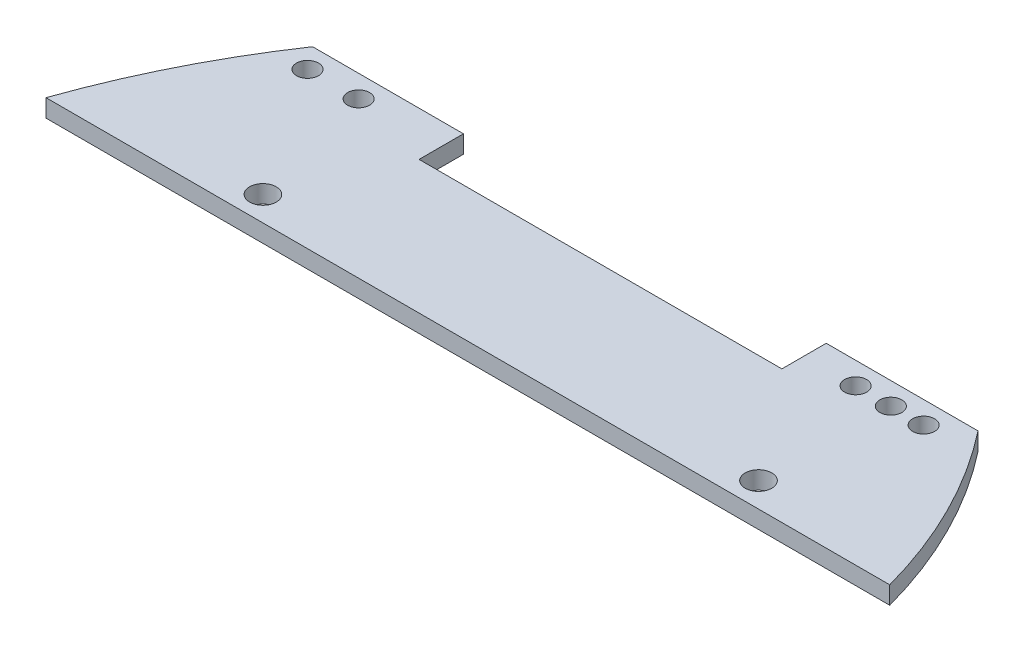
ISO-10303-21;
HEADER;
FILE_DESCRIPTION(('STEP AP214'),'2;1');
FILE_NAME('part.step','',(''),(''),'','','');
FILE_SCHEMA(('AUTOMOTIVE_DESIGN { 1 0 10303 214 1 1 1 1 }'));
ENDSEC;
DATA;
#1=APPLICATION_CONTEXT('core data for automotive mechanical design processes');
#2=APPLICATION_PROTOCOL_DEFINITION('international standard','automotive_design',2000,#1);
#3=PRODUCT_CONTEXT('',#1,'mechanical');
#4=PRODUCT('Part','Part','',(#3));
#5=PRODUCT_RELATED_PRODUCT_CATEGORY('part','',(#4));
#6=PRODUCT_DEFINITION_FORMATION('','',#4);
#7=PRODUCT_DEFINITION_CONTEXT('part definition',#1,'design');
#8=PRODUCT_DEFINITION('design','',#6,#7);
#9=PRODUCT_DEFINITION_SHAPE('','',#8);
#10=(LENGTH_UNIT() NAMED_UNIT(*) SI_UNIT(.MILLI.,.METRE.));
#11=(NAMED_UNIT(*) PLANE_ANGLE_UNIT() SI_UNIT($,.RADIAN.));
#12=(NAMED_UNIT(*) SI_UNIT($,.STERADIAN.) SOLID_ANGLE_UNIT());
#13=UNCERTAINTY_MEASURE_WITH_UNIT(LENGTH_MEASURE(1.E-05),#10,'distance_accuracy_value','');
#14=(GEOMETRIC_REPRESENTATION_CONTEXT(3) GLOBAL_UNCERTAINTY_ASSIGNED_CONTEXT((#13)) GLOBAL_UNIT_ASSIGNED_CONTEXT((#10,
#11,#12)) REPRESENTATION_CONTEXT('',''));
#15=CARTESIAN_POINT('',(0.,0.,0.));
#16=DIRECTION('',(0.,0.,1.));
#17=DIRECTION('',(1.,0.,0.));
#18=AXIS2_PLACEMENT_3D('',#15,#16,#17);
#19=CARTESIAN_POINT('',(-37.5,2.,0.));
#20=DIRECTION('',(0.,0.,1.));
#21=DIRECTION('',(1.,0.,0.));
#22=AXIS2_PLACEMENT_3D('',#19,#20,#21);
#23=PLANE('',#22);
#24=DIRECTION('',(-1.,0.,0.));
#25=VECTOR('',#24,1.);
#26=CARTESIAN_POINT('',(-37.5,2.,0.));
#27=LINE('',#26,#25);
#28=CARTESIAN_POINT('',(-20.5,2.,0.));
#29=VERTEX_POINT('',#28);
#30=CARTESIAN_POINT('',(-37.5,2.,0.));
#31=VERTEX_POINT('',#30);
#32=EDGE_CURVE('E173',#29,#31,#27,.T.);
#33=ORIENTED_EDGE('',*,*,#32,.F.);
#34=DIRECTION('',(0.,1.,0.));
#35=VECTOR('',#34,1.);
#36=CARTESIAN_POINT('',(-20.5,0.,0.));
#37=LINE('',#36,#35);
#38=CARTESIAN_POINT('',(-20.5,0.,0.));
#39=VERTEX_POINT('',#38);
#40=EDGE_CURVE('E161',#39,#29,#37,.T.);
#41=ORIENTED_EDGE('',*,*,#40,.F.);
#42=DIRECTION('',(-1.,0.,0.));
#43=VECTOR('',#42,1.);
#44=CARTESIAN_POINT('',(-37.5,0.,0.));
#45=LINE('',#44,#43);
#46=CARTESIAN_POINT('',(-37.5,0.,0.));
#47=VERTEX_POINT('',#46);
#48=EDGE_CURVE('E143',#39,#47,#45,.T.);
#49=ORIENTED_EDGE('',*,*,#48,.T.);
#50=DIRECTION('',(0.,-1.,0.));
#51=VECTOR('',#50,1.);
#52=CARTESIAN_POINT('',(-37.5,2.,0.));
#53=LINE('',#52,#51);
#54=EDGE_CURVE('E54',#31,#47,#53,.T.);
#55=ORIENTED_EDGE('',*,*,#54,.F.);
#56=EDGE_LOOP('',(#33,#41,#49,#55));
#57=FACE_BOUND('',#56,.T.);
#58=ADVANCED_FACE('F45',(#57),#23,.F.);
#59=CARTESIAN_POINT('',(-6.52717629431904,2.,34.6522980439395));
#60=DIRECTION('',(0.,-1.,0.));
#61=DIRECTION('',(0.,0.,-1.));
#62=AXIS2_PLACEMENT_3D('',#59,#60,#61);
#63=CYLINDRICAL_SURFACE('',#62,56.0283322273389);
#64=CARTESIAN_POINT('',(-6.52717629431904,0.,34.6522980439395));
#65=DIRECTION('',(0.,1.,0.));
#66=DIRECTION('',(0.,0.,-1.));
#67=AXIS2_PLACEMENT_3D('',#64,#65,#66);
#68=CIRCLE('',#67,56.0283322273389);
#69=CARTESIAN_POINT('',(47.5513238162483,0.,20.));
#70=VERTEX_POINT('',#69);
#71=CARTESIAN_POINT('',(37.5,0.,0.));
#72=VERTEX_POINT('',#71);
#73=EDGE_CURVE('E164',#70,#72,#68,.T.);
#74=ORIENTED_EDGE('',*,*,#73,.T.);
#75=DIRECTION('',(0.,-1.,0.));
#76=VECTOR('',#75,1.);
#77=CARTESIAN_POINT('',(37.5,2.,0.));
#78=LINE('',#77,#76);
#79=CARTESIAN_POINT('',(37.5,2.,0.));
#80=VERTEX_POINT('',#79);
#81=EDGE_CURVE('E11',#80,#72,#78,.T.);
#82=ORIENTED_EDGE('',*,*,#81,.F.);
#83=CARTESIAN_POINT('',(-6.52717629431904,2.,34.6522980439395));
#84=DIRECTION('',(0.,1.,0.));
#85=DIRECTION('',(0.,0.,-1.));
#86=AXIS2_PLACEMENT_3D('',#83,#84,#85);
#87=CIRCLE('',#86,56.0283322273389);
#88=CARTESIAN_POINT('',(47.5513238162483,2.,20.));
#89=VERTEX_POINT('',#88);
#90=EDGE_CURVE('E170',#89,#80,#87,.T.);
#91=ORIENTED_EDGE('',*,*,#90,.F.);
#92=DIRECTION('',(0.,-1.,0.));
#93=VECTOR('',#92,1.);
#94=CARTESIAN_POINT('',(47.5513238162483,2.,20.));
#95=LINE('',#94,#93);
#96=EDGE_CURVE('E181',#89,#70,#95,.T.);
#97=ORIENTED_EDGE('',*,*,#96,.T.);
#98=EDGE_LOOP('',(#74,#82,#91,#97));
#99=FACE_BOUND('',#98,.T.);
#100=ADVANCED_FACE('F47',(#99),#63,.T.);
#101=CARTESIAN_POINT('',(20.3949385789422,0.,0.));
#102=VERTEX_POINT('',#101);
#103=EDGE_CURVE('E185',#72,#102,#45,.T.);
#104=ORIENTED_EDGE('',*,*,#103,.T.);
#105=DIRECTION('',(0.,1.,0.));
#106=VECTOR('',#105,1.);
#107=CARTESIAN_POINT('',(20.3949385789422,0.,0.));
#108=LINE('',#107,#106);
#109=CARTESIAN_POINT('',(20.3949385789422,2.,0.));
#110=VERTEX_POINT('',#109);
#111=EDGE_CURVE('E165',#102,#110,#108,.T.);
#112=ORIENTED_EDGE('',*,*,#111,.T.);
#113=EDGE_CURVE('E98',#80,#110,#27,.T.);
#114=ORIENTED_EDGE('',*,*,#113,.F.);
#115=ORIENTED_EDGE('',*,*,#81,.T.);
#116=EDGE_LOOP('',(#104,#112,#114,#115));
#117=FACE_BOUND('',#116,.T.);
#118=ADVANCED_FACE('F222',(#117),#23,.F.);
#119=CARTESIAN_POINT('',(34.4689479159723,2.,48.6948877723841));
#120=DIRECTION('',(0.,-1.,0.));
#121=DIRECTION('',(0.,0.,-1.));
#122=AXIS2_PLACEMENT_3D('',#119,#120,#121);
#123=CYLINDRICAL_SURFACE('',#122,86.8948879928906);
#124=CARTESIAN_POINT('',(34.4689479159723,0.,48.6948877723841));
#125=DIRECTION('',(0.,1.,0.));
#126=DIRECTION('',(0.,0.,1.));
#127=AXIS2_PLACEMENT_3D('',#124,#125,#126);
#128=CIRCLE('',#127,86.8948879928906);
#129=CARTESIAN_POINT('',(-47.5513238162483,0.,20.));
#130=VERTEX_POINT('',#129);
#131=EDGE_CURVE('E189',#47,#130,#128,.T.);
#132=ORIENTED_EDGE('',*,*,#131,.T.);
#133=DIRECTION('',(0.,-1.,0.));
#134=VECTOR('',#133,1.);
#135=CARTESIAN_POINT('',(-47.5513238162483,2.,20.));
#136=LINE('',#135,#134);
#137=CARTESIAN_POINT('',(-47.5513238162483,2.,20.));
#138=VERTEX_POINT('',#137);
#139=EDGE_CURVE('E196',#138,#130,#136,.T.);
#140=ORIENTED_EDGE('',*,*,#139,.F.);
#141=CARTESIAN_POINT('',(34.4689479159723,2.,48.6948877723841));
#142=DIRECTION('',(0.,1.,0.));
#143=DIRECTION('',(0.,0.,1.));
#144=AXIS2_PLACEMENT_3D('',#141,#142,#143);
#145=CIRCLE('',#144,86.8948879928906);
#146=EDGE_CURVE('E176',#31,#138,#145,.T.);
#147=ORIENTED_EDGE('',*,*,#146,.F.);
#148=ORIENTED_EDGE('',*,*,#54,.T.);
#149=EDGE_LOOP('',(#132,#140,#147,#148));
#150=FACE_BOUND('',#149,.T.);
#151=ADVANCED_FACE('F203',(#150),#123,.T.);
#152=CARTESIAN_POINT('',(-47.5513238162483,2.,20.));
#153=DIRECTION('',(0.,0.,-1.));
#154=DIRECTION('',(-1.,0.,0.));
#155=AXIS2_PLACEMENT_3D('',#152,#153,#154);
#156=PLANE('',#155);
#157=DIRECTION('',(1.,0.,0.));
#158=VECTOR('',#157,1.);
#159=CARTESIAN_POINT('',(-47.5513238162483,0.,20.));
#160=LINE('',#159,#158);
#161=EDGE_CURVE('E91',#130,#70,#160,.T.);
#162=ORIENTED_EDGE('',*,*,#161,.T.);
#163=ORIENTED_EDGE('',*,*,#96,.F.);
#164=DIRECTION('',(1.,0.,0.));
#165=VECTOR('',#164,1.);
#166=CARTESIAN_POINT('',(-47.5513238162483,2.,20.));
#167=LINE('',#166,#165);
#168=EDGE_CURVE('E70',#138,#89,#167,.T.);
#169=ORIENTED_EDGE('',*,*,#168,.F.);
#170=ORIENTED_EDGE('',*,*,#139,.T.);
#171=EDGE_LOOP('',(#162,#163,#169,#170));
#172=FACE_BOUND('',#171,.T.);
#173=ADVANCED_FACE('F211',(#172),#156,.F.);
#174=CARTESIAN_POINT('',(-6.52717629431904,2.,34.6522980439395));
#175=DIRECTION('',(0.,-1.,0.));
#176=DIRECTION('',(0.,0.,-1.));
#177=AXIS2_PLACEMENT_3D('',#174,#175,#176);
#178=PLANE('',#177);
#179=CARTESIAN_POINT('',(-25.8803145300549,2.,17.2197010936735));
#180=DIRECTION('',(0.,1.,0.));
#181=DIRECTION('',(0.,0.,1.));
#182=AXIS2_PLACEMENT_3D('',#179,#180,#181);
#183=CIRCLE('',#182,1.5);
#184=CARTESIAN_POINT('',(-25.8803145300549,2.,18.7197010936735));
#185=VERTEX_POINT('',#184);
#186=EDGE_CURVE('E310',#185,#185,#183,.T.);
#187=ORIENTED_EDGE('',*,*,#186,.F.);
#188=EDGE_LOOP('',(#187));
#189=FACE_BOUND('',#188,.T.);
#190=CARTESIAN_POINT('',(29.9799259658057,2.,17.2197010936735));
#191=DIRECTION('',(0.,1.,0.));
#192=DIRECTION('',(0.,0.,1.));
#193=AXIS2_PLACEMENT_3D('',#190,#191,#192);
#194=CIRCLE('',#193,1.5);
#195=CARTESIAN_POINT('',(29.9799259658057,2.,18.7197010936735));
#196=VERTEX_POINT('',#195);
#197=EDGE_CURVE('E306',#196,#196,#194,.T.);
#198=ORIENTED_EDGE('',*,*,#197,.F.);
#199=EDGE_LOOP('',(#198));
#200=FACE_BOUND('',#199,.T.);
#201=CARTESIAN_POINT('',(33.8698431599721,2.,2.5));
#202=DIRECTION('',(0.,1.,0.));
#203=DIRECTION('',(0.,0.,1.));
#204=AXIS2_PLACEMENT_3D('',#201,#202,#203);
#205=CIRCLE('',#204,1.24);
#206=CARTESIAN_POINT('',(33.8698431599721,2.,3.74));
#207=VERTEX_POINT('',#206);
#208=EDGE_CURVE('E283',#207,#207,#205,.T.);
#209=ORIENTED_EDGE('',*,*,#208,.F.);
#210=EDGE_LOOP('',(#209));
#211=FACE_BOUND('',#210,.T.);
#212=CARTESIAN_POINT('',(30.1746052653553,2.,2.5));
#213=DIRECTION('',(0.,1.,0.));
#214=DIRECTION('',(0.,0.,1.));
#215=AXIS2_PLACEMENT_3D('',#212,#213,#214);
#216=CIRCLE('',#215,1.24);
#217=CARTESIAN_POINT('',(30.1746052653553,2.,3.74));
#218=VERTEX_POINT('',#217);
#219=EDGE_CURVE('E289',#218,#218,#216,.T.);
#220=ORIENTED_EDGE('',*,*,#219,.F.);
#221=EDGE_LOOP('',(#220));
#222=FACE_BOUND('',#221,.T.);
#223=CARTESIAN_POINT('',(-35.5742504810952,2.,2.5));
#224=DIRECTION('',(0.,1.,0.));
#225=DIRECTION('',(0.,0.,1.));
#226=AXIS2_PLACEMENT_3D('',#223,#224,#225);
#227=CIRCLE('',#226,1.24);
#228=CARTESIAN_POINT('',(-35.5742504810952,2.,3.74));
#229=VERTEX_POINT('',#228);
#230=EDGE_CURVE('E295',#229,#229,#227,.T.);
#231=ORIENTED_EDGE('',*,*,#230,.F.);
#232=EDGE_LOOP('',(#231));
#233=FACE_BOUND('',#232,.T.);
#234=CARTESIAN_POINT('',(26.2041900807139,2.,2.5));
#235=DIRECTION('',(0.,1.,0.));
#236=DIRECTION('',(0.,0.,1.));
#237=AXIS2_PLACEMENT_3D('',#234,#235,#236);
#238=CIRCLE('',#237,1.24);
#239=CARTESIAN_POINT('',(26.2041900807139,2.,3.74));
#240=VERTEX_POINT('',#239);
#241=EDGE_CURVE('E279',#240,#240,#238,.T.);
#242=ORIENTED_EDGE('',*,*,#241,.F.);
#243=EDGE_LOOP('',(#242));
#244=FACE_BOUND('',#243,.T.);
#245=CARTESIAN_POINT('',(-29.8148259775896,2.,2.5));
#246=DIRECTION('',(0.,1.,0.));
#247=DIRECTION('',(0.,0.,1.));
#248=AXIS2_PLACEMENT_3D('',#245,#246,#247);
#249=CIRCLE('',#248,1.24);
#250=CARTESIAN_POINT('',(-29.8148259775896,2.,3.74));
#251=VERTEX_POINT('',#250);
#252=EDGE_CURVE('E151',#251,#251,#249,.T.);
#253=ORIENTED_EDGE('',*,*,#252,.F.);
#254=EDGE_LOOP('',(#253));
#255=FACE_BOUND('',#254,.T.);
#256=DIRECTION('',(1.,0.,0.));
#257=VECTOR('',#256,1.);
#258=CARTESIAN_POINT('',(20.3949385789422,2.,5.));
#259=LINE('',#258,#257);
#260=CARTESIAN_POINT('',(-20.5,2.,5.));
#261=VERTEX_POINT('',#260);
#262=CARTESIAN_POINT('',(20.3949385789422,2.,5.));
#263=VERTEX_POINT('',#262);
#264=EDGE_CURVE('E148',#261,#263,#259,.T.);
#265=ORIENTED_EDGE('',*,*,#264,.F.);
#266=DIRECTION('',(0.,0.,1.));
#267=VECTOR('',#266,1.);
#268=CARTESIAN_POINT('',(-20.5,2.,5.));
#269=LINE('',#268,#267);
#270=EDGE_CURVE('E127',#29,#261,#269,.T.);
#271=ORIENTED_EDGE('',*,*,#270,.F.);
#272=ORIENTED_EDGE('',*,*,#32,.T.);
#273=ORIENTED_EDGE('',*,*,#146,.T.);
#274=ORIENTED_EDGE('',*,*,#168,.T.);
#275=ORIENTED_EDGE('',*,*,#90,.T.);
#276=ORIENTED_EDGE('',*,*,#113,.T.);
#277=DIRECTION('',(0.,0.,-1.));
#278=VECTOR('',#277,1.);
#279=CARTESIAN_POINT('',(20.3949385789422,2.,0.));
#280=LINE('',#279,#278);
#281=EDGE_CURVE('E145',#263,#110,#280,.T.);
#282=ORIENTED_EDGE('',*,*,#281,.F.);
#283=EDGE_LOOP('',(#265,#271,#272,#273,#274,#275,#276,#282));
#284=FACE_BOUND('',#283,.T.);
#285=ADVANCED_FACE('F213',(#189,#200,#211,#222,#233,#244,#255,#284),#178,.F.);
#286=CARTESIAN_POINT('',(-6.52717629431904,0.,34.6522980439395));
#287=DIRECTION('',(0.,-1.,0.));
#288=DIRECTION('',(0.,0.,-1.));
#289=AXIS2_PLACEMENT_3D('',#286,#287,#288);
#290=PLANE('',#289);
#291=CARTESIAN_POINT('',(-25.8803145300549,0.,17.2197010936735));
#292=DIRECTION('',(0.,1.,0.));
#293=DIRECTION('',(0.,0.,1.));
#294=AXIS2_PLACEMENT_3D('',#291,#292,#293);
#295=CIRCLE('',#294,1.5);
#296=CARTESIAN_POINT('',(-25.8803145300549,0.,18.7197010936735));
#297=VERTEX_POINT('',#296);
#298=EDGE_CURVE('E252',#297,#297,#295,.T.);
#299=ORIENTED_EDGE('',*,*,#298,.T.);
#300=EDGE_LOOP('',(#299));
#301=FACE_BOUND('',#300,.T.);
#302=CARTESIAN_POINT('',(29.9799259658057,0.,17.2197010936735));
#303=DIRECTION('',(0.,1.,0.));
#304=DIRECTION('',(0.,0.,1.));
#305=AXIS2_PLACEMENT_3D('',#302,#303,#304);
#306=CIRCLE('',#305,1.5);
#307=CARTESIAN_POINT('',(29.9799259658057,0.,18.7197010936735));
#308=VERTEX_POINT('',#307);
#309=EDGE_CURVE('E256',#308,#308,#306,.T.);
#310=ORIENTED_EDGE('',*,*,#309,.T.);
#311=EDGE_LOOP('',(#310));
#312=FACE_BOUND('',#311,.T.);
#313=CARTESIAN_POINT('',(33.8698431599721,0.,2.5));
#314=DIRECTION('',(0.,1.,0.));
#315=DIRECTION('',(0.,0.,1.));
#316=AXIS2_PLACEMENT_3D('',#313,#314,#315);
#317=CIRCLE('',#316,1.24);
#318=CARTESIAN_POINT('',(33.8698431599721,0.,3.74));
#319=VERTEX_POINT('',#318);
#320=EDGE_CURVE('E260',#319,#319,#317,.T.);
#321=ORIENTED_EDGE('',*,*,#320,.T.);
#322=EDGE_LOOP('',(#321));
#323=FACE_BOUND('',#322,.T.);
#324=CARTESIAN_POINT('',(30.1746052653553,0.,2.5));
#325=DIRECTION('',(0.,1.,0.));
#326=DIRECTION('',(0.,0.,1.));
#327=AXIS2_PLACEMENT_3D('',#324,#325,#326);
#328=CIRCLE('',#327,1.24);
#329=CARTESIAN_POINT('',(30.1746052653553,0.,3.74));
#330=VERTEX_POINT('',#329);
#331=EDGE_CURVE('E264',#330,#330,#328,.T.);
#332=ORIENTED_EDGE('',*,*,#331,.T.);
#333=EDGE_LOOP('',(#332));
#334=FACE_BOUND('',#333,.T.);
#335=CARTESIAN_POINT('',(-35.5742504810952,0.,2.5));
#336=DIRECTION('',(0.,1.,0.));
#337=DIRECTION('',(0.,0.,1.));
#338=AXIS2_PLACEMENT_3D('',#335,#336,#337);
#339=CIRCLE('',#338,1.24);
#340=CARTESIAN_POINT('',(-35.5742504810952,0.,3.74));
#341=VERTEX_POINT('',#340);
#342=EDGE_CURVE('E268',#341,#341,#339,.T.);
#343=ORIENTED_EDGE('',*,*,#342,.T.);
#344=EDGE_LOOP('',(#343));
#345=FACE_BOUND('',#344,.T.);
#346=CARTESIAN_POINT('',(26.2041900807139,0.,2.5));
#347=DIRECTION('',(0.,1.,0.));
#348=DIRECTION('',(0.,0.,1.));
#349=AXIS2_PLACEMENT_3D('',#346,#347,#348);
#350=CIRCLE('',#349,1.24);
#351=CARTESIAN_POINT('',(26.2041900807139,0.,3.74));
#352=VERTEX_POINT('',#351);
#353=EDGE_CURVE('E272',#352,#352,#350,.T.);
#354=ORIENTED_EDGE('',*,*,#353,.T.);
#355=EDGE_LOOP('',(#354));
#356=FACE_BOUND('',#355,.T.);
#357=CARTESIAN_POINT('',(-29.8148259775896,0.,2.5));
#358=DIRECTION('',(0.,1.,0.));
#359=DIRECTION('',(0.,0.,1.));
#360=AXIS2_PLACEMENT_3D('',#357,#358,#359);
#361=CIRCLE('',#360,1.24);
#362=CARTESIAN_POINT('',(-29.8148259775896,0.,3.74));
#363=VERTEX_POINT('',#362);
#364=EDGE_CURVE('E158',#363,#363,#361,.T.);
#365=ORIENTED_EDGE('',*,*,#364,.T.);
#366=EDGE_LOOP('',(#365));
#367=FACE_BOUND('',#366,.T.);
#368=DIRECTION('',(0.,0.,1.));
#369=VECTOR('',#368,1.);
#370=CARTESIAN_POINT('',(-20.5,0.,5.));
#371=LINE('',#370,#369);
#372=CARTESIAN_POINT('',(-20.5,0.,5.));
#373=VERTEX_POINT('',#372);
#374=EDGE_CURVE('E124',#39,#373,#371,.T.);
#375=ORIENTED_EDGE('',*,*,#374,.T.);
#376=DIRECTION('',(1.,0.,0.));
#377=VECTOR('',#376,1.);
#378=CARTESIAN_POINT('',(20.3949385789422,0.,5.));
#379=LINE('',#378,#377);
#380=CARTESIAN_POINT('',(20.3949385789422,0.,5.));
#381=VERTEX_POINT('',#380);
#382=EDGE_CURVE('E135',#373,#381,#379,.T.);
#383=ORIENTED_EDGE('',*,*,#382,.T.);
#384=DIRECTION('',(0.,0.,-1.));
#385=VECTOR('',#384,1.);
#386=CARTESIAN_POINT('',(20.3949385789422,0.,0.));
#387=LINE('',#386,#385);
#388=EDGE_CURVE('E61',#381,#102,#387,.T.);
#389=ORIENTED_EDGE('',*,*,#388,.T.);
#390=ORIENTED_EDGE('',*,*,#103,.F.);
#391=ORIENTED_EDGE('',*,*,#73,.F.);
#392=ORIENTED_EDGE('',*,*,#161,.F.);
#393=ORIENTED_EDGE('',*,*,#131,.F.);
#394=ORIENTED_EDGE('',*,*,#48,.F.);
#395=EDGE_LOOP('',(#375,#383,#389,#390,#391,#392,#393,#394));
#396=FACE_BOUND('',#395,.T.);
#397=ADVANCED_FACE('F141',(#301,#312,#323,#334,#345,#356,#367,#396),#290,.T.);
#398=CARTESIAN_POINT('',(-20.5,0.,5.));
#399=DIRECTION('',(-1.,0.,0.));
#400=DIRECTION('',(0.,0.,1.));
#401=AXIS2_PLACEMENT_3D('',#398,#399,#400);
#402=PLANE('',#401);
#403=ORIENTED_EDGE('',*,*,#270,.T.);
#404=DIRECTION('',(0.,1.,0.));
#405=VECTOR('',#404,1.);
#406=CARTESIAN_POINT('',(-20.5,0.,5.));
#407=LINE('',#406,#405);
#408=EDGE_CURVE('E120',#373,#261,#407,.T.);
#409=ORIENTED_EDGE('',*,*,#408,.F.);
#410=ORIENTED_EDGE('',*,*,#374,.F.);
#411=ORIENTED_EDGE('',*,*,#40,.T.);
#412=EDGE_LOOP('',(#403,#409,#410,#411));
#413=FACE_BOUND('',#412,.T.);
#414=ADVANCED_FACE('F122',(#413),#402,.F.);
#415=CARTESIAN_POINT('',(20.3949385789422,0.,0.));
#416=DIRECTION('',(1.,0.,0.));
#417=DIRECTION('',(0.,0.,-1.));
#418=AXIS2_PLACEMENT_3D('',#415,#416,#417);
#419=PLANE('',#418);
#420=ORIENTED_EDGE('',*,*,#281,.T.);
#421=ORIENTED_EDGE('',*,*,#111,.F.);
#422=ORIENTED_EDGE('',*,*,#388,.F.);
#423=DIRECTION('',(0.,1.,0.));
#424=VECTOR('',#423,1.);
#425=CARTESIAN_POINT('',(20.3949385789422,0.,5.));
#426=LINE('',#425,#424);
#427=EDGE_CURVE('E132',#381,#263,#426,.T.);
#428=ORIENTED_EDGE('',*,*,#427,.T.);
#429=EDGE_LOOP('',(#420,#421,#422,#428));
#430=FACE_BOUND('',#429,.T.);
#431=ADVANCED_FACE('F233',(#430),#419,.F.);
#432=CARTESIAN_POINT('',(20.3949385789422,0.,5.));
#433=DIRECTION('',(0.,0.,1.));
#434=DIRECTION('',(1.,0.,0.));
#435=AXIS2_PLACEMENT_3D('',#432,#433,#434);
#436=PLANE('',#435);
#437=ORIENTED_EDGE('',*,*,#264,.T.);
#438=ORIENTED_EDGE('',*,*,#427,.F.);
#439=ORIENTED_EDGE('',*,*,#382,.F.);
#440=ORIENTED_EDGE('',*,*,#408,.T.);
#441=EDGE_LOOP('',(#437,#438,#439,#440));
#442=FACE_BOUND('',#441,.T.);
#443=ADVANCED_FACE('F136',(#442),#436,.F.);
#444=CARTESIAN_POINT('',(-29.8148259775896,0.,2.5));
#445=DIRECTION('',(0.,1.,0.));
#446=DIRECTION('',(0.,0.,1.));
#447=AXIS2_PLACEMENT_3D('',#444,#445,#446);
#448=CYLINDRICAL_SURFACE('',#447,1.24);
#449=ORIENTED_EDGE('',*,*,#364,.F.);
#450=EDGE_LOOP('',(#449));
#451=FACE_BOUND('',#450,.T.);
#452=ORIENTED_EDGE('',*,*,#252,.T.);
#453=EDGE_LOOP('',(#452));
#454=FACE_BOUND('',#453,.T.);
#455=ADVANCED_FACE('F239',(#451,#454),#448,.F.);
#456=CARTESIAN_POINT('',(26.2041900807139,0.,2.5));
#457=DIRECTION('',(0.,1.,0.));
#458=DIRECTION('',(0.,0.,1.));
#459=AXIS2_PLACEMENT_3D('',#456,#457,#458);
#460=CYLINDRICAL_SURFACE('',#459,1.24);
#461=ORIENTED_EDGE('',*,*,#353,.F.);
#462=EDGE_LOOP('',(#461));
#463=FACE_BOUND('',#462,.T.);
#464=ORIENTED_EDGE('',*,*,#241,.T.);
#465=EDGE_LOOP('',(#464));
#466=FACE_BOUND('',#465,.T.);
#467=ADVANCED_FACE('F332',(#463,#466),#460,.F.);
#468=CARTESIAN_POINT('',(-35.5742504810952,0.,2.5));
#469=DIRECTION('',(0.,1.,0.));
#470=DIRECTION('',(0.,0.,1.));
#471=AXIS2_PLACEMENT_3D('',#468,#469,#470);
#472=CYLINDRICAL_SURFACE('',#471,1.24);
#473=ORIENTED_EDGE('',*,*,#342,.F.);
#474=EDGE_LOOP('',(#473));
#475=FACE_BOUND('',#474,.T.);
#476=ORIENTED_EDGE('',*,*,#230,.T.);
#477=EDGE_LOOP('',(#476));
#478=FACE_BOUND('',#477,.T.);
#479=ADVANCED_FACE('F336',(#475,#478),#472,.F.);
#480=CARTESIAN_POINT('',(30.1746052653553,0.,2.5));
#481=DIRECTION('',(0.,1.,0.));
#482=DIRECTION('',(0.,0.,1.));
#483=AXIS2_PLACEMENT_3D('',#480,#481,#482);
#484=CYLINDRICAL_SURFACE('',#483,1.24);
#485=ORIENTED_EDGE('',*,*,#331,.F.);
#486=EDGE_LOOP('',(#485));
#487=FACE_BOUND('',#486,.T.);
#488=ORIENTED_EDGE('',*,*,#219,.T.);
#489=EDGE_LOOP('',(#488));
#490=FACE_BOUND('',#489,.T.);
#491=ADVANCED_FACE('F342',(#487,#490),#484,.F.);
#492=CARTESIAN_POINT('',(33.8698431599721,0.,2.5));
#493=DIRECTION('',(0.,1.,0.));
#494=DIRECTION('',(0.,0.,1.));
#495=AXIS2_PLACEMENT_3D('',#492,#493,#494);
#496=CYLINDRICAL_SURFACE('',#495,1.24);
#497=ORIENTED_EDGE('',*,*,#320,.F.);
#498=EDGE_LOOP('',(#497));
#499=FACE_BOUND('',#498,.T.);
#500=ORIENTED_EDGE('',*,*,#208,.T.);
#501=EDGE_LOOP('',(#500));
#502=FACE_BOUND('',#501,.T.);
#503=ADVANCED_FACE('F351',(#499,#502),#496,.F.);
#504=CARTESIAN_POINT('',(29.9799259658057,0.,17.2197010936735));
#505=DIRECTION('',(0.,1.,0.));
#506=DIRECTION('',(0.,0.,1.));
#507=AXIS2_PLACEMENT_3D('',#504,#505,#506);
#508=CYLINDRICAL_SURFACE('',#507,1.5);
#509=ORIENTED_EDGE('',*,*,#309,.F.);
#510=EDGE_LOOP('',(#509));
#511=FACE_BOUND('',#510,.T.);
#512=ORIENTED_EDGE('',*,*,#197,.T.);
#513=EDGE_LOOP('',(#512));
#514=FACE_BOUND('',#513,.T.);
#515=ADVANCED_FACE('F347',(#511,#514),#508,.F.);
#516=CARTESIAN_POINT('',(-25.8803145300549,0.,17.2197010936735));
#517=DIRECTION('',(0.,1.,0.));
#518=DIRECTION('',(0.,0.,1.));
#519=AXIS2_PLACEMENT_3D('',#516,#517,#518);
#520=CYLINDRICAL_SURFACE('',#519,1.5);
#521=ORIENTED_EDGE('',*,*,#298,.F.);
#522=EDGE_LOOP('',(#521));
#523=FACE_BOUND('',#522,.T.);
#524=ORIENTED_EDGE('',*,*,#186,.T.);
#525=EDGE_LOOP('',(#524));
#526=FACE_BOUND('',#525,.T.);
#527=ADVANCED_FACE('F317',(#523,#526),#520,.F.);
#528=CLOSED_SHELL('',(#58,#100,#118,#151,#173,#285,#397,#414,#431,#443,#455,#467,#479,#491,#503,
#515,#527));
#529=MANIFOLD_SOLID_BREP('B2',#528);
#530=ADVANCED_BREP_SHAPE_REPRESENTATION('',(#18,#529),#14);
#531=SHAPE_DEFINITION_REPRESENTATION(#9,#530);
ENDSEC;
END-ISO-10303-21;
